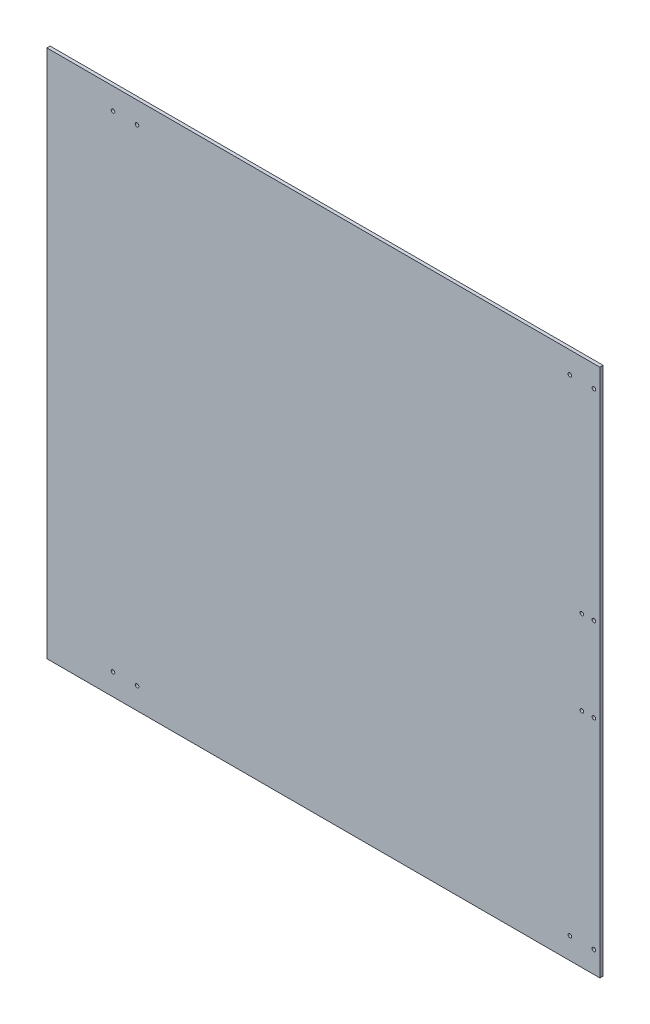
ISO-10303-21;
HEADER;
FILE_DESCRIPTION(('STEP AP214'),'2;1');
FILE_NAME('part.step','',(''),(''),'','','');
FILE_SCHEMA(('AUTOMOTIVE_DESIGN { 1 0 10303 214 1 1 1 1 }'));
ENDSEC;
DATA;
#1=APPLICATION_CONTEXT('core data for automotive mechanical design processes');
#2=APPLICATION_PROTOCOL_DEFINITION('international standard','automotive_design',2000,#1);
#3=PRODUCT_CONTEXT('',#1,'mechanical');
#4=PRODUCT('Part','Part','',(#3));
#5=PRODUCT_RELATED_PRODUCT_CATEGORY('part','',(#4));
#6=PRODUCT_DEFINITION_FORMATION('','',#4);
#7=PRODUCT_DEFINITION_CONTEXT('part definition',#1,'design');
#8=PRODUCT_DEFINITION('design','',#6,#7);
#9=PRODUCT_DEFINITION_SHAPE('','',#8);
#10=(LENGTH_UNIT() NAMED_UNIT(*) SI_UNIT(.MILLI.,.METRE.));
#11=(NAMED_UNIT(*) PLANE_ANGLE_UNIT() SI_UNIT($,.RADIAN.));
#12=(NAMED_UNIT(*) SI_UNIT($,.STERADIAN.) SOLID_ANGLE_UNIT());
#13=UNCERTAINTY_MEASURE_WITH_UNIT(LENGTH_MEASURE(1.E-05),#10,'distance_accuracy_value','');
#14=(GEOMETRIC_REPRESENTATION_CONTEXT(3) GLOBAL_UNCERTAINTY_ASSIGNED_CONTEXT((#13)) GLOBAL_UNIT_ASSIGNED_CONTEXT((#10,
#11,#12)) REPRESENTATION_CONTEXT('',''));
#15=CARTESIAN_POINT('',(0.,0.,0.));
#16=DIRECTION('',(0.,0.,1.));
#17=DIRECTION('',(1.,0.,0.));
#18=AXIS2_PLACEMENT_3D('',#15,#16,#17);
#19=CARTESIAN_POINT('',(0.,0.,2.7));
#20=DIRECTION('',(-1.,0.,0.));
#21=DIRECTION('',(0.,0.,1.));
#22=AXIS2_PLACEMENT_3D('',#19,#20,#21);
#23=PLANE('',#22);
#24=DIRECTION('',(0.,1.,0.));
#25=VECTOR('',#24,1.);
#26=CARTESIAN_POINT('',(0.,0.,0.));
#27=LINE('',#26,#25);
#28=CARTESIAN_POINT('',(0.,0.,0.));
#29=VERTEX_POINT('',#28);
#30=CARTESIAN_POINT('',(0.,440.,0.));
#31=VERTEX_POINT('',#30);
#32=EDGE_CURVE('E101',#29,#31,#27,.T.);
#33=ORIENTED_EDGE('',*,*,#32,.T.);
#34=DIRECTION('',(0.,0.,-1.));
#35=VECTOR('',#34,1.);
#36=CARTESIAN_POINT('',(0.,440.,2.7));
#37=LINE('',#36,#35);
#38=CARTESIAN_POINT('',(0.,440.,2.7));
#39=VERTEX_POINT('',#38);
#40=EDGE_CURVE('E11',#39,#31,#37,.T.);
#41=ORIENTED_EDGE('',*,*,#40,.F.);
#42=DIRECTION('',(0.,1.,0.));
#43=VECTOR('',#42,1.);
#44=CARTESIAN_POINT('',(0.,0.,2.7));
#45=LINE('',#44,#43);
#46=CARTESIAN_POINT('',(0.,0.,2.7));
#47=VERTEX_POINT('',#46);
#48=EDGE_CURVE('E88',#47,#39,#45,.T.);
#49=ORIENTED_EDGE('',*,*,#48,.F.);
#50=DIRECTION('',(0.,0.,-1.));
#51=VECTOR('',#50,1.);
#52=CARTESIAN_POINT('',(0.,0.,2.7));
#53=LINE('',#52,#51);
#54=EDGE_CURVE('E97',#47,#29,#53,.T.);
#55=ORIENTED_EDGE('',*,*,#54,.T.);
#56=EDGE_LOOP('',(#33,#41,#49,#55));
#57=FACE_BOUND('',#56,.T.);
#58=ADVANCED_FACE('F35',(#57),#23,.F.);
#59=CARTESIAN_POINT('',(0.,440.,2.7));
#60=DIRECTION('',(0.,-1.,0.));
#61=DIRECTION('',(1.,0.,0.));
#62=AXIS2_PLACEMENT_3D('',#59,#60,#61);
#63=PLANE('',#62);
#64=DIRECTION('',(-1.,0.,0.));
#65=VECTOR('',#64,1.);
#66=CARTESIAN_POINT('',(0.,440.,0.));
#67=LINE('',#66,#65);
#68=CARTESIAN_POINT('',(-460.,440.,0.));
#69=VERTEX_POINT('',#68);
#70=EDGE_CURVE('E92',#31,#69,#67,.T.);
#71=ORIENTED_EDGE('',*,*,#70,.T.);
#72=DIRECTION('',(0.,0.,-1.));
#73=VECTOR('',#72,1.);
#74=CARTESIAN_POINT('',(-460.,440.,2.7));
#75=LINE('',#74,#73);
#76=CARTESIAN_POINT('',(-460.,440.,2.7));
#77=VERTEX_POINT('',#76);
#78=EDGE_CURVE('E44',#77,#69,#75,.T.);
#79=ORIENTED_EDGE('',*,*,#78,.F.);
#80=DIRECTION('',(-1.,0.,0.));
#81=VECTOR('',#80,1.);
#82=CARTESIAN_POINT('',(0.,440.,2.7));
#83=LINE('',#82,#81);
#84=EDGE_CURVE('E83',#39,#77,#83,.T.);
#85=ORIENTED_EDGE('',*,*,#84,.F.);
#86=ORIENTED_EDGE('',*,*,#40,.T.);
#87=EDGE_LOOP('',(#71,#79,#85,#86));
#88=FACE_BOUND('',#87,.T.);
#89=ADVANCED_FACE('F91',(#88),#63,.F.);
#90=CARTESIAN_POINT('',(-460.,0.,2.7));
#91=DIRECTION('',(1.,0.,0.));
#92=DIRECTION('',(0.,0.,-1.));
#93=AXIS2_PLACEMENT_3D('',#90,#91,#92);
#94=PLANE('',#93);
#95=DIRECTION('',(0.,-1.,0.));
#96=VECTOR('',#95,1.);
#97=CARTESIAN_POINT('',(-460.,0.,0.));
#98=LINE('',#97,#96);
#99=CARTESIAN_POINT('',(-460.,0.,0.));
#100=VERTEX_POINT('',#99);
#101=EDGE_CURVE('E70',#69,#100,#98,.T.);
#102=ORIENTED_EDGE('',*,*,#101,.T.);
#103=DIRECTION('',(0.,0.,-1.));
#104=VECTOR('',#103,1.);
#105=CARTESIAN_POINT('',(-460.,0.,2.7));
#106=LINE('',#105,#104);
#107=CARTESIAN_POINT('',(-460.,0.,2.7));
#108=VERTEX_POINT('',#107);
#109=EDGE_CURVE('E93',#108,#100,#106,.T.);
#110=ORIENTED_EDGE('',*,*,#109,.F.);
#111=DIRECTION('',(0.,-1.,0.));
#112=VECTOR('',#111,1.);
#113=CARTESIAN_POINT('',(-460.,0.,2.7));
#114=LINE('',#113,#112);
#115=EDGE_CURVE('E86',#77,#108,#114,.T.);
#116=ORIENTED_EDGE('',*,*,#115,.F.);
#117=ORIENTED_EDGE('',*,*,#78,.T.);
#118=EDGE_LOOP('',(#102,#110,#116,#117));
#119=FACE_BOUND('',#118,.T.);
#120=ADVANCED_FACE('F95',(#119),#94,.F.);
#121=CARTESIAN_POINT('',(0.,0.,2.7));
#122=DIRECTION('',(0.,1.,0.));
#123=DIRECTION('',(-1.,0.,0.));
#124=AXIS2_PLACEMENT_3D('',#121,#122,#123);
#125=PLANE('',#124);
#126=DIRECTION('',(1.,0.,0.));
#127=VECTOR('',#126,1.);
#128=CARTESIAN_POINT('',(0.,0.,0.));
#129=LINE('',#128,#127);
#130=EDGE_CURVE('E76',#100,#29,#129,.T.);
#131=ORIENTED_EDGE('',*,*,#130,.T.);
#132=ORIENTED_EDGE('',*,*,#54,.F.);
#133=DIRECTION('',(1.,0.,0.));
#134=VECTOR('',#133,1.);
#135=CARTESIAN_POINT('',(0.,0.,2.7));
#136=LINE('',#135,#134);
#137=EDGE_CURVE('E53',#108,#47,#136,.T.);
#138=ORIENTED_EDGE('',*,*,#137,.F.);
#139=ORIENTED_EDGE('',*,*,#109,.T.);
#140=EDGE_LOOP('',(#131,#132,#138,#139));
#141=FACE_BOUND('',#140,.T.);
#142=ADVANCED_FACE('F178',(#141),#125,.F.);
#143=CARTESIAN_POINT('',(0.,0.,2.7));
#144=DIRECTION('',(0.,0.,1.));
#145=DIRECTION('',(1.,0.,0.));
#146=AXIS2_PLACEMENT_3D('',#143,#144,#145);
#147=PLANE('',#146);
#148=CARTESIAN_POINT('',(-15.,185.,2.7));
#149=DIRECTION('',(0.,0.,1.));
#150=DIRECTION('',(-1.,0.,0.));
#151=AXIS2_PLACEMENT_3D('',#148,#149,#150);
#152=CIRCLE('',#151,1.5);
#153=CARTESIAN_POINT('',(-16.5,185.,2.7));
#154=VERTEX_POINT('',#153);
#155=EDGE_CURVE('E339',#154,#154,#152,.T.);
#156=ORIENTED_EDGE('',*,*,#155,.F.);
#157=EDGE_LOOP('',(#156));
#158=FACE_BOUND('',#157,.T.);
#159=CARTESIAN_POINT('',(-4.99999999999998,185.,2.7));
#160=DIRECTION('',(0.,0.,1.));
#161=DIRECTION('',(-1.,0.,0.));
#162=AXIS2_PLACEMENT_3D('',#159,#160,#161);
#163=CIRCLE('',#162,1.5);
#164=CARTESIAN_POINT('',(-6.49999999999998,185.,2.7));
#165=VERTEX_POINT('',#164);
#166=EDGE_CURVE('E340',#165,#165,#163,.T.);
#167=ORIENTED_EDGE('',*,*,#166,.F.);
#168=EDGE_LOOP('',(#167));
#169=FACE_BOUND('',#168,.T.);
#170=CARTESIAN_POINT('',(-4.99999999999998,255.,2.7));
#171=DIRECTION('',(0.,0.,1.));
#172=DIRECTION('',(1.,0.,0.));
#173=AXIS2_PLACEMENT_3D('',#170,#171,#172);
#174=CIRCLE('',#173,1.5);
#175=CARTESIAN_POINT('',(-3.49999999999998,255.,2.7));
#176=VERTEX_POINT('',#175);
#177=EDGE_CURVE('E343',#176,#176,#174,.T.);
#178=ORIENTED_EDGE('',*,*,#177,.F.);
#179=EDGE_LOOP('',(#178));
#180=FACE_BOUND('',#179,.T.);
#181=CARTESIAN_POINT('',(-15.,255.,2.7));
#182=DIRECTION('',(0.,0.,1.));
#183=DIRECTION('',(1.,0.,0.));
#184=AXIS2_PLACEMENT_3D('',#181,#182,#183);
#185=CIRCLE('',#184,1.5);
#186=CARTESIAN_POINT('',(-13.5,255.,2.7));
#187=VERTEX_POINT('',#186);
#188=EDGE_CURVE('E138',#187,#187,#185,.T.);
#189=ORIENTED_EDGE('',*,*,#188,.F.);
#190=EDGE_LOOP('',(#189));
#191=FACE_BOUND('',#190,.T.);
#192=CARTESIAN_POINT('',(-385.,422.,2.7));
#193=DIRECTION('',(0.,0.,1.));
#194=DIRECTION('',(1.,0.,0.));
#195=AXIS2_PLACEMENT_3D('',#192,#193,#194);
#196=CIRCLE('',#195,1.50000000000002);
#197=CARTESIAN_POINT('',(-383.5,422.,2.7));
#198=VERTEX_POINT('',#197);
#199=EDGE_CURVE('E162',#198,#198,#196,.T.);
#200=ORIENTED_EDGE('',*,*,#199,.F.);
#201=EDGE_LOOP('',(#200));
#202=FACE_BOUND('',#201,.T.);
#203=CARTESIAN_POINT('',(-4.99999999999995,18.,2.7));
#204=DIRECTION('',(0.,0.,1.));
#205=DIRECTION('',(-1.,0.,0.));
#206=AXIS2_PLACEMENT_3D('',#203,#204,#205);
#207=CIRCLE('',#206,1.5);
#208=CARTESIAN_POINT('',(-6.49999999999995,18.,2.7));
#209=VERTEX_POINT('',#208);
#210=EDGE_CURVE('E158',#209,#209,#207,.T.);
#211=ORIENTED_EDGE('',*,*,#210,.F.);
#212=EDGE_LOOP('',(#211));
#213=FACE_BOUND('',#212,.T.);
#214=CARTESIAN_POINT('',(-25.,18.,2.7));
#215=DIRECTION('',(0.,0.,1.));
#216=DIRECTION('',(-1.,0.,0.));
#217=AXIS2_PLACEMENT_3D('',#214,#215,#216);
#218=CIRCLE('',#217,1.5);
#219=CARTESIAN_POINT('',(-26.5,18.,2.7));
#220=VERTEX_POINT('',#219);
#221=EDGE_CURVE('E161',#220,#220,#218,.T.);
#222=ORIENTED_EDGE('',*,*,#221,.F.);
#223=EDGE_LOOP('',(#222));
#224=FACE_BOUND('',#223,.T.);
#225=CARTESIAN_POINT('',(-25.,422.,2.7));
#226=DIRECTION('',(0.,0.,1.));
#227=DIRECTION('',(1.,0.,0.));
#228=AXIS2_PLACEMENT_3D('',#225,#226,#227);
#229=CIRCLE('',#228,1.5);
#230=CARTESIAN_POINT('',(-23.5,422.,2.7));
#231=VERTEX_POINT('',#230);
#232=EDGE_CURVE('E165',#231,#231,#229,.T.);
#233=ORIENTED_EDGE('',*,*,#232,.F.);
#234=EDGE_LOOP('',(#233));
#235=FACE_BOUND('',#234,.T.);
#236=CARTESIAN_POINT('',(-405.,422.,2.7));
#237=DIRECTION('',(0.,0.,1.));
#238=DIRECTION('',(1.,0.,0.));
#239=AXIS2_PLACEMENT_3D('',#236,#237,#238);
#240=CIRCLE('',#239,1.50000000000002);
#241=CARTESIAN_POINT('',(-403.5,422.,2.7));
#242=VERTEX_POINT('',#241);
#243=EDGE_CURVE('E154',#242,#242,#240,.T.);
#244=ORIENTED_EDGE('',*,*,#243,.F.);
#245=EDGE_LOOP('',(#244));
#246=FACE_BOUND('',#245,.T.);
#247=CARTESIAN_POINT('',(-405.,18.,2.7));
#248=DIRECTION('',(0.,0.,1.));
#249=DIRECTION('',(-1.,0.,0.));
#250=AXIS2_PLACEMENT_3D('',#247,#248,#249);
#251=CIRCLE('',#250,1.50000000000002);
#252=CARTESIAN_POINT('',(-406.5,18.,2.7));
#253=VERTEX_POINT('',#252);
#254=EDGE_CURVE('E149',#253,#253,#251,.T.);
#255=ORIENTED_EDGE('',*,*,#254,.F.);
#256=EDGE_LOOP('',(#255));
#257=FACE_BOUND('',#256,.T.);
#258=CARTESIAN_POINT('',(-385.,17.9999999999999,2.7));
#259=DIRECTION('',(0.,0.,1.));
#260=DIRECTION('',(-1.,0.,0.));
#261=AXIS2_PLACEMENT_3D('',#258,#259,#260);
#262=CIRCLE('',#261,1.50000000000002);
#263=CARTESIAN_POINT('',(-386.5,17.9999999999999,2.7));
#264=VERTEX_POINT('',#263);
#265=EDGE_CURVE('E145',#264,#264,#262,.T.);
#266=ORIENTED_EDGE('',*,*,#265,.F.);
#267=EDGE_LOOP('',(#266));
#268=FACE_BOUND('',#267,.T.);
#269=CARTESIAN_POINT('',(-5.,422.,2.7));
#270=DIRECTION('',(0.,0.,1.));
#271=DIRECTION('',(1.,0.,0.));
#272=AXIS2_PLACEMENT_3D('',#269,#270,#271);
#273=CIRCLE('',#272,1.5);
#274=CARTESIAN_POINT('',(-3.5,422.,2.7));
#275=VERTEX_POINT('',#274);
#276=EDGE_CURVE('E114',#275,#275,#273,.T.);
#277=ORIENTED_EDGE('',*,*,#276,.F.);
#278=EDGE_LOOP('',(#277));
#279=FACE_BOUND('',#278,.T.);
#280=ORIENTED_EDGE('',*,*,#48,.T.);
#281=ORIENTED_EDGE('',*,*,#84,.T.);
#282=ORIENTED_EDGE('',*,*,#115,.T.);
#283=ORIENTED_EDGE('',*,*,#137,.T.);
#284=EDGE_LOOP('',(#280,#281,#282,#283));
#285=FACE_BOUND('',#284,.T.);
#286=ADVANCED_FACE('F84',(#158,#169,#180,#191,#202,#213,#224,#235,#246,#257,#268,#279,#285),
#147,.T.);
#287=CARTESIAN_POINT('',(0.,0.,0.));
#288=DIRECTION('',(0.,0.,1.));
#289=DIRECTION('',(1.,0.,0.));
#290=AXIS2_PLACEMENT_3D('',#287,#288,#289);
#291=PLANE('',#290);
#292=CARTESIAN_POINT('',(-15.,185.,0.));
#293=DIRECTION('',(0.,0.,1.));
#294=DIRECTION('',(1.,0.,0.));
#295=AXIS2_PLACEMENT_3D('',#292,#293,#294);
#296=CIRCLE('',#295,1.5);
#297=CARTESIAN_POINT('',(-13.5,185.,0.));
#298=VERTEX_POINT('',#297);
#299=EDGE_CURVE('E38',#298,#298,#296,.T.);
#300=ORIENTED_EDGE('',*,*,#299,.T.);
#301=EDGE_LOOP('',(#300));
#302=FACE_BOUND('',#301,.T.);
#303=CARTESIAN_POINT('',(-4.99999999999998,185.,0.));
#304=DIRECTION('',(0.,0.,1.));
#305=DIRECTION('',(1.,0.,0.));
#306=AXIS2_PLACEMENT_3D('',#303,#304,#305);
#307=CIRCLE('',#306,1.5);
#308=CARTESIAN_POINT('',(-3.49999999999998,185.,0.));
#309=VERTEX_POINT('',#308);
#310=EDGE_CURVE('E140',#309,#309,#307,.T.);
#311=ORIENTED_EDGE('',*,*,#310,.T.);
#312=EDGE_LOOP('',(#311));
#313=FACE_BOUND('',#312,.T.);
#314=CARTESIAN_POINT('',(-4.99999999999998,255.,0.));
#315=DIRECTION('',(0.,0.,1.));
#316=DIRECTION('',(1.,0.,0.));
#317=AXIS2_PLACEMENT_3D('',#314,#315,#316);
#318=CIRCLE('',#317,1.5);
#319=CARTESIAN_POINT('',(-3.49999999999998,255.,0.));
#320=VERTEX_POINT('',#319);
#321=EDGE_CURVE('E137',#320,#320,#318,.T.);
#322=ORIENTED_EDGE('',*,*,#321,.T.);
#323=EDGE_LOOP('',(#322));
#324=FACE_BOUND('',#323,.T.);
#325=CARTESIAN_POINT('',(-15.,255.,0.));
#326=DIRECTION('',(0.,0.,1.));
#327=DIRECTION('',(1.,0.,0.));
#328=AXIS2_PLACEMENT_3D('',#325,#326,#327);
#329=CIRCLE('',#328,1.5);
#330=CARTESIAN_POINT('',(-13.5,255.,0.));
#331=VERTEX_POINT('',#330);
#332=EDGE_CURVE('E134',#331,#331,#329,.T.);
#333=ORIENTED_EDGE('',*,*,#332,.T.);
#334=EDGE_LOOP('',(#333));
#335=FACE_BOUND('',#334,.T.);
#336=CARTESIAN_POINT('',(-385.,422.,0.));
#337=DIRECTION('',(0.,0.,1.));
#338=DIRECTION('',(1.,0.,0.));
#339=AXIS2_PLACEMENT_3D('',#336,#337,#338);
#340=CIRCLE('',#339,1.50000000000002);
#341=CARTESIAN_POINT('',(-383.5,422.,0.));
#342=VERTEX_POINT('',#341);
#343=EDGE_CURVE('E104',#342,#342,#340,.T.);
#344=ORIENTED_EDGE('',*,*,#343,.T.);
#345=EDGE_LOOP('',(#344));
#346=FACE_BOUND('',#345,.T.);
#347=CARTESIAN_POINT('',(-4.99999999999995,18.,0.));
#348=DIRECTION('',(0.,0.,1.));
#349=DIRECTION('',(1.,0.,0.));
#350=AXIS2_PLACEMENT_3D('',#347,#348,#349);
#351=CIRCLE('',#350,1.5);
#352=CARTESIAN_POINT('',(-3.49999999999995,18.,0.));
#353=VERTEX_POINT('',#352);
#354=EDGE_CURVE('E129',#353,#353,#351,.T.);
#355=ORIENTED_EDGE('',*,*,#354,.T.);
#356=EDGE_LOOP('',(#355));
#357=FACE_BOUND('',#356,.T.);
#358=CARTESIAN_POINT('',(-25.,18.,0.));
#359=DIRECTION('',(0.,0.,1.));
#360=DIRECTION('',(1.,0.,0.));
#361=AXIS2_PLACEMENT_3D('',#358,#359,#360);
#362=CIRCLE('',#361,1.5);
#363=CARTESIAN_POINT('',(-23.4999999999999,18.,0.));
#364=VERTEX_POINT('',#363);
#365=EDGE_CURVE('E126',#364,#364,#362,.T.);
#366=ORIENTED_EDGE('',*,*,#365,.T.);
#367=EDGE_LOOP('',(#366));
#368=FACE_BOUND('',#367,.T.);
#369=CARTESIAN_POINT('',(-25.,422.,0.));
#370=DIRECTION('',(0.,0.,1.));
#371=DIRECTION('',(1.,0.,0.));
#372=AXIS2_PLACEMENT_3D('',#369,#370,#371);
#373=CIRCLE('',#372,1.5);
#374=CARTESIAN_POINT('',(-23.5,422.,0.));
#375=VERTEX_POINT('',#374);
#376=EDGE_CURVE('E123',#375,#375,#373,.T.);
#377=ORIENTED_EDGE('',*,*,#376,.T.);
#378=EDGE_LOOP('',(#377));
#379=FACE_BOUND('',#378,.T.);
#380=CARTESIAN_POINT('',(-405.,422.,0.));
#381=DIRECTION('',(0.,0.,1.));
#382=DIRECTION('',(1.,0.,0.));
#383=AXIS2_PLACEMENT_3D('',#380,#381,#382);
#384=CIRCLE('',#383,1.50000000000002);
#385=CARTESIAN_POINT('',(-403.5,422.,0.));
#386=VERTEX_POINT('',#385);
#387=EDGE_CURVE('E120',#386,#386,#384,.T.);
#388=ORIENTED_EDGE('',*,*,#387,.T.);
#389=EDGE_LOOP('',(#388));
#390=FACE_BOUND('',#389,.T.);
#391=CARTESIAN_POINT('',(-405.,18.,0.));
#392=DIRECTION('',(0.,0.,1.));
#393=DIRECTION('',(1.,0.,0.));
#394=AXIS2_PLACEMENT_3D('',#391,#392,#393);
#395=CIRCLE('',#394,1.50000000000002);
#396=CARTESIAN_POINT('',(-403.5,18.,0.));
#397=VERTEX_POINT('',#396);
#398=EDGE_CURVE('E117',#397,#397,#395,.T.);
#399=ORIENTED_EDGE('',*,*,#398,.T.);
#400=EDGE_LOOP('',(#399));
#401=FACE_BOUND('',#400,.T.);
#402=CARTESIAN_POINT('',(-385.,17.9999999999999,0.));
#403=DIRECTION('',(0.,0.,1.));
#404=DIRECTION('',(1.,0.,0.));
#405=AXIS2_PLACEMENT_3D('',#402,#403,#404);
#406=CIRCLE('',#405,1.50000000000002);
#407=CARTESIAN_POINT('',(-383.5,17.9999999999999,0.));
#408=VERTEX_POINT('',#407);
#409=EDGE_CURVE('E113',#408,#408,#406,.T.);
#410=ORIENTED_EDGE('',*,*,#409,.T.);
#411=EDGE_LOOP('',(#410));
#412=FACE_BOUND('',#411,.T.);
#413=CARTESIAN_POINT('',(-5.,422.,0.));
#414=DIRECTION('',(0.,0.,1.));
#415=DIRECTION('',(1.,0.,0.));
#416=AXIS2_PLACEMENT_3D('',#413,#414,#415);
#417=CIRCLE('',#416,1.5);
#418=CARTESIAN_POINT('',(-3.5,422.,0.));
#419=VERTEX_POINT('',#418);
#420=EDGE_CURVE('E110',#419,#419,#417,.T.);
#421=ORIENTED_EDGE('',*,*,#420,.T.);
#422=EDGE_LOOP('',(#421));
#423=FACE_BOUND('',#422,.T.);
#424=ORIENTED_EDGE('',*,*,#32,.F.);
#425=ORIENTED_EDGE('',*,*,#130,.F.);
#426=ORIENTED_EDGE('',*,*,#101,.F.);
#427=ORIENTED_EDGE('',*,*,#70,.F.);
#428=EDGE_LOOP('',(#424,#425,#426,#427));
#429=FACE_BOUND('',#428,.T.);
#430=ADVANCED_FACE('F177',(#302,#313,#324,#335,#346,#357,#368,#379,#390,#401,#412,#423,#429),
#291,.F.);
#431=CARTESIAN_POINT('',(-5.,422.,-7.3));
#432=DIRECTION('',(0.,0.,1.));
#433=DIRECTION('',(1.,0.,0.));
#434=AXIS2_PLACEMENT_3D('',#431,#432,#433);
#435=CYLINDRICAL_SURFACE('',#434,1.5);
#436=ORIENTED_EDGE('',*,*,#276,.T.);
#437=EDGE_LOOP('',(#436));
#438=FACE_BOUND('',#437,.T.);
#439=ORIENTED_EDGE('',*,*,#420,.F.);
#440=EDGE_LOOP('',(#439));
#441=FACE_BOUND('',#440,.T.);
#442=ADVANCED_FACE('F173',(#438,#441),#435,.F.);
#443=CARTESIAN_POINT('',(-385.,17.9999999999999,-7.3));
#444=DIRECTION('',(0.,0.,1.));
#445=DIRECTION('',(1.,0.,0.));
#446=AXIS2_PLACEMENT_3D('',#443,#444,#445);
#447=CYLINDRICAL_SURFACE('',#446,1.50000000000002);
#448=ORIENTED_EDGE('',*,*,#265,.T.);
#449=EDGE_LOOP('',(#448));
#450=FACE_BOUND('',#449,.T.);
#451=ORIENTED_EDGE('',*,*,#409,.F.);
#452=EDGE_LOOP('',(#451));
#453=FACE_BOUND('',#452,.T.);
#454=ADVANCED_FACE('F217',(#450,#453),#447,.F.);
#455=CARTESIAN_POINT('',(-405.,18.,-7.3));
#456=DIRECTION('',(0.,0.,1.));
#457=DIRECTION('',(1.,0.,0.));
#458=AXIS2_PLACEMENT_3D('',#455,#456,#457);
#459=CYLINDRICAL_SURFACE('',#458,1.50000000000002);
#460=ORIENTED_EDGE('',*,*,#254,.T.);
#461=EDGE_LOOP('',(#460));
#462=FACE_BOUND('',#461,.T.);
#463=ORIENTED_EDGE('',*,*,#398,.F.);
#464=EDGE_LOOP('',(#463));
#465=FACE_BOUND('',#464,.T.);
#466=ADVANCED_FACE('F226',(#462,#465),#459,.F.);
#467=CARTESIAN_POINT('',(-405.,422.,-7.3));
#468=DIRECTION('',(0.,0.,1.));
#469=DIRECTION('',(1.,0.,0.));
#470=AXIS2_PLACEMENT_3D('',#467,#468,#469);
#471=CYLINDRICAL_SURFACE('',#470,1.50000000000002);
#472=ORIENTED_EDGE('',*,*,#243,.T.);
#473=EDGE_LOOP('',(#472));
#474=FACE_BOUND('',#473,.T.);
#475=ORIENTED_EDGE('',*,*,#387,.F.);
#476=EDGE_LOOP('',(#475));
#477=FACE_BOUND('',#476,.T.);
#478=ADVANCED_FACE('F235',(#474,#477),#471,.F.);
#479=CARTESIAN_POINT('',(-25.,422.,-7.3));
#480=DIRECTION('',(0.,0.,1.));
#481=DIRECTION('',(1.,0.,0.));
#482=AXIS2_PLACEMENT_3D('',#479,#480,#481);
#483=CYLINDRICAL_SURFACE('',#482,1.5);
#484=ORIENTED_EDGE('',*,*,#232,.T.);
#485=EDGE_LOOP('',(#484));
#486=FACE_BOUND('',#485,.T.);
#487=ORIENTED_EDGE('',*,*,#376,.F.);
#488=EDGE_LOOP('',(#487));
#489=FACE_BOUND('',#488,.T.);
#490=ADVANCED_FACE('F245',(#486,#489),#483,.F.);
#491=CARTESIAN_POINT('',(-25.,18.,-7.3));
#492=DIRECTION('',(0.,0.,1.));
#493=DIRECTION('',(1.,0.,0.));
#494=AXIS2_PLACEMENT_3D('',#491,#492,#493);
#495=CYLINDRICAL_SURFACE('',#494,1.5);
#496=ORIENTED_EDGE('',*,*,#221,.T.);
#497=EDGE_LOOP('',(#496));
#498=FACE_BOUND('',#497,.T.);
#499=ORIENTED_EDGE('',*,*,#365,.F.);
#500=EDGE_LOOP('',(#499));
#501=FACE_BOUND('',#500,.T.);
#502=ADVANCED_FACE('F255',(#498,#501),#495,.F.);
#503=CARTESIAN_POINT('',(-4.99999999999995,18.,-7.3));
#504=DIRECTION('',(0.,0.,1.));
#505=DIRECTION('',(1.,0.,0.));
#506=AXIS2_PLACEMENT_3D('',#503,#504,#505);
#507=CYLINDRICAL_SURFACE('',#506,1.5);
#508=ORIENTED_EDGE('',*,*,#210,.T.);
#509=EDGE_LOOP('',(#508));
#510=FACE_BOUND('',#509,.T.);
#511=ORIENTED_EDGE('',*,*,#354,.F.);
#512=EDGE_LOOP('',(#511));
#513=FACE_BOUND('',#512,.T.);
#514=ADVANCED_FACE('F265',(#510,#513),#507,.F.);
#515=CARTESIAN_POINT('',(-385.,422.,-7.3));
#516=DIRECTION('',(0.,0.,1.));
#517=DIRECTION('',(1.,0.,0.));
#518=AXIS2_PLACEMENT_3D('',#515,#516,#517);
#519=CYLINDRICAL_SURFACE('',#518,1.50000000000002);
#520=ORIENTED_EDGE('',*,*,#199,.T.);
#521=EDGE_LOOP('',(#520));
#522=FACE_BOUND('',#521,.T.);
#523=ORIENTED_EDGE('',*,*,#343,.F.);
#524=EDGE_LOOP('',(#523));
#525=FACE_BOUND('',#524,.T.);
#526=ADVANCED_FACE('F275',(#522,#525),#519,.F.);
#527=CARTESIAN_POINT('',(-15.,255.,-7.3));
#528=DIRECTION('',(0.,0.,1.));
#529=DIRECTION('',(1.,0.,0.));
#530=AXIS2_PLACEMENT_3D('',#527,#528,#529);
#531=CYLINDRICAL_SURFACE('',#530,1.5);
#532=ORIENTED_EDGE('',*,*,#188,.T.);
#533=EDGE_LOOP('',(#532));
#534=FACE_BOUND('',#533,.T.);
#535=ORIENTED_EDGE('',*,*,#332,.F.);
#536=EDGE_LOOP('',(#535));
#537=FACE_BOUND('',#536,.T.);
#538=ADVANCED_FACE('F284',(#534,#537),#531,.F.);
#539=CARTESIAN_POINT('',(-4.99999999999998,255.,-7.3));
#540=DIRECTION('',(0.,0.,1.));
#541=DIRECTION('',(1.,0.,0.));
#542=AXIS2_PLACEMENT_3D('',#539,#540,#541);
#543=CYLINDRICAL_SURFACE('',#542,1.5);
#544=ORIENTED_EDGE('',*,*,#177,.T.);
#545=EDGE_LOOP('',(#544));
#546=FACE_BOUND('',#545,.T.);
#547=ORIENTED_EDGE('',*,*,#321,.F.);
#548=EDGE_LOOP('',(#547));
#549=FACE_BOUND('',#548,.T.);
#550=ADVANCED_FACE('F303',(#546,#549),#543,.F.);
#551=CARTESIAN_POINT('',(-4.99999999999998,185.,-7.3));
#552=DIRECTION('',(0.,0.,1.));
#553=DIRECTION('',(1.,0.,0.));
#554=AXIS2_PLACEMENT_3D('',#551,#552,#553);
#555=CYLINDRICAL_SURFACE('',#554,1.5);
#556=ORIENTED_EDGE('',*,*,#166,.T.);
#557=EDGE_LOOP('',(#556));
#558=FACE_BOUND('',#557,.T.);
#559=ORIENTED_EDGE('',*,*,#310,.F.);
#560=EDGE_LOOP('',(#559));
#561=FACE_BOUND('',#560,.T.);
#562=ADVANCED_FACE('F313',(#558,#561),#555,.F.);
#563=CARTESIAN_POINT('',(-15.,185.,-7.3));
#564=DIRECTION('',(0.,0.,1.));
#565=DIRECTION('',(1.,0.,0.));
#566=AXIS2_PLACEMENT_3D('',#563,#564,#565);
#567=CYLINDRICAL_SURFACE('',#566,1.5);
#568=ORIENTED_EDGE('',*,*,#155,.T.);
#569=EDGE_LOOP('',(#568));
#570=FACE_BOUND('',#569,.T.);
#571=ORIENTED_EDGE('',*,*,#299,.F.);
#572=EDGE_LOOP('',(#571));
#573=FACE_BOUND('',#572,.T.);
#574=ADVANCED_FACE('F323',(#570,#573),#567,.F.);
#575=CLOSED_SHELL('',(#58,#89,#120,#142,#286,#430,#442,#454,#466,#478,#490,#502,#514,#526,#538,
#550,#562,#574));
#576=MANIFOLD_SOLID_BREP('B2',#575);
#577=ADVANCED_BREP_SHAPE_REPRESENTATION('',(#18,#576),#14);
#578=SHAPE_DEFINITION_REPRESENTATION(#9,#577);
ENDSEC;
END-ISO-10303-21;
